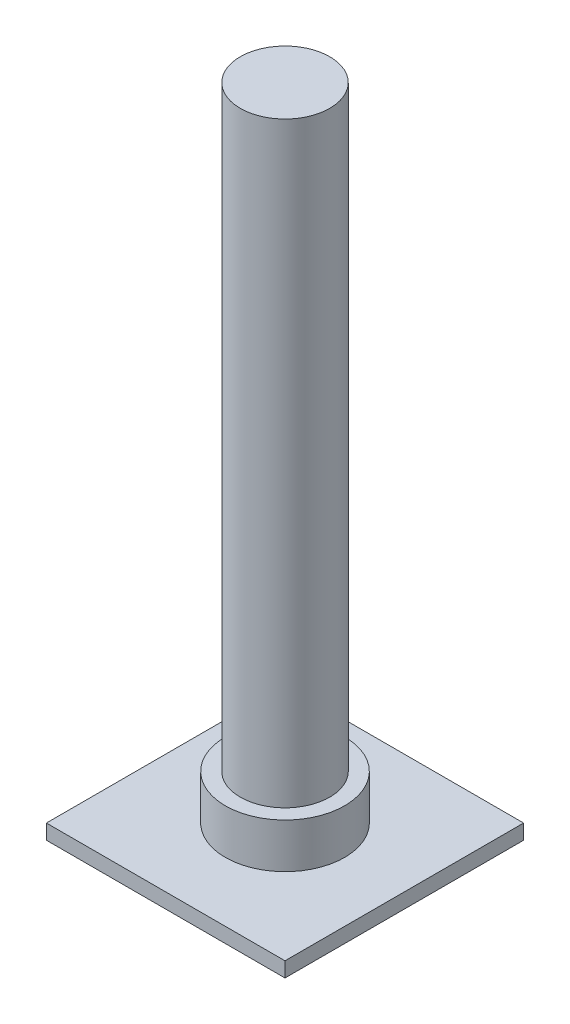
ISO-10303-21;
HEADER;
FILE_DESCRIPTION(('STEP AP214'),'2;1');
FILE_NAME('part.step','',(''),(''),'','','');
FILE_SCHEMA(('AUTOMOTIVE_DESIGN { 1 0 10303 214 1 1 1 1 }'));
ENDSEC;
DATA;
#1=APPLICATION_CONTEXT('core data for automotive mechanical design processes');
#2=APPLICATION_PROTOCOL_DEFINITION('international standard','automotive_design',2000,#1);
#3=PRODUCT_CONTEXT('',#1,'mechanical');
#4=PRODUCT('Part','Part','',(#3));
#5=PRODUCT_RELATED_PRODUCT_CATEGORY('part','',(#4));
#6=PRODUCT_DEFINITION_FORMATION('','',#4);
#7=PRODUCT_DEFINITION_CONTEXT('part definition',#1,'design');
#8=PRODUCT_DEFINITION('design','',#6,#7);
#9=PRODUCT_DEFINITION_SHAPE('','',#8);
#10=(LENGTH_UNIT() NAMED_UNIT(*) SI_UNIT(.MILLI.,.METRE.));
#11=(NAMED_UNIT(*) PLANE_ANGLE_UNIT() SI_UNIT($,.RADIAN.));
#12=(NAMED_UNIT(*) SI_UNIT($,.STERADIAN.) SOLID_ANGLE_UNIT());
#13=UNCERTAINTY_MEASURE_WITH_UNIT(LENGTH_MEASURE(1.E-05),#10,'distance_accuracy_value','');
#14=(GEOMETRIC_REPRESENTATION_CONTEXT(3) GLOBAL_UNCERTAINTY_ASSIGNED_CONTEXT((#13)) GLOBAL_UNIT_ASSIGNED_CONTEXT((#10,
#11,#12)) REPRESENTATION_CONTEXT('',''));
#15=CARTESIAN_POINT('',(0.,0.,0.));
#16=DIRECTION('',(0.,0.,1.));
#17=DIRECTION('',(1.,0.,0.));
#18=AXIS2_PLACEMENT_3D('',#15,#16,#17);
#19=CARTESIAN_POINT('',(0.,5.,0.));
#20=DIRECTION('',(1.,0.,0.));
#21=DIRECTION('',(0.,0.,-1.));
#22=AXIS2_PLACEMENT_3D('',#19,#20,#21);
#23=PLANE('',#22);
#24=DIRECTION('',(0.,0.,1.));
#25=VECTOR('',#24,1.);
#26=CARTESIAN_POINT('',(0.,0.,0.));
#27=LINE('',#26,#25);
#28=CARTESIAN_POINT('',(0.,0.,-80.));
#29=VERTEX_POINT('',#28);
#30=CARTESIAN_POINT('',(0.,0.,0.));
#31=VERTEX_POINT('',#30);
#32=EDGE_CURVE('E101',#29,#31,#27,.T.);
#33=ORIENTED_EDGE('',*,*,#32,.T.);
#34=DIRECTION('',(0.,-1.,0.));
#35=VECTOR('',#34,1.);
#36=CARTESIAN_POINT('',(0.,5.,0.));
#37=LINE('',#36,#35);
#38=CARTESIAN_POINT('',(0.,5.,0.));
#39=VERTEX_POINT('',#38);
#40=EDGE_CURVE('E37',#39,#31,#37,.T.);
#41=ORIENTED_EDGE('',*,*,#40,.F.);
#42=DIRECTION('',(0.,0.,1.));
#43=VECTOR('',#42,1.);
#44=CARTESIAN_POINT('',(0.,5.,0.));
#45=LINE('',#44,#43);
#46=CARTESIAN_POINT('',(0.,5.,-80.));
#47=VERTEX_POINT('',#46);
#48=EDGE_CURVE('E88',#47,#39,#45,.T.);
#49=ORIENTED_EDGE('',*,*,#48,.F.);
#50=DIRECTION('',(0.,-1.,0.));
#51=VECTOR('',#50,1.);
#52=CARTESIAN_POINT('',(0.,5.,-80.));
#53=LINE('',#52,#51);
#54=EDGE_CURVE('E97',#47,#29,#53,.T.);
#55=ORIENTED_EDGE('',*,*,#54,.T.);
#56=EDGE_LOOP('',(#33,#41,#49,#55));
#57=FACE_BOUND('',#56,.T.);
#58=ADVANCED_FACE('F34',(#57),#23,.F.);
#59=CARTESIAN_POINT('',(0.,5.,0.));
#60=DIRECTION('',(0.,0.,-1.));
#61=DIRECTION('',(-1.,0.,0.));
#62=AXIS2_PLACEMENT_3D('',#59,#60,#61);
#63=PLANE('',#62);
#64=DIRECTION('',(1.,0.,0.));
#65=VECTOR('',#64,1.);
#66=CARTESIAN_POINT('',(0.,0.,0.));
#67=LINE('',#66,#65);
#68=CARTESIAN_POINT('',(80.,0.,0.));
#69=VERTEX_POINT('',#68);
#70=EDGE_CURVE('E93',#31,#69,#67,.T.);
#71=ORIENTED_EDGE('',*,*,#70,.T.);
#72=DIRECTION('',(0.,-1.,0.));
#73=VECTOR('',#72,1.);
#74=CARTESIAN_POINT('',(80.,5.,0.));
#75=LINE('',#74,#73);
#76=CARTESIAN_POINT('',(80.,5.,0.));
#77=VERTEX_POINT('',#76);
#78=EDGE_CURVE('E91',#77,#69,#75,.T.);
#79=ORIENTED_EDGE('',*,*,#78,.F.);
#80=DIRECTION('',(1.,0.,0.));
#81=VECTOR('',#80,1.);
#82=CARTESIAN_POINT('',(0.,5.,0.));
#83=LINE('',#82,#81);
#84=EDGE_CURVE('E83',#39,#77,#83,.T.);
#85=ORIENTED_EDGE('',*,*,#84,.F.);
#86=ORIENTED_EDGE('',*,*,#40,.T.);
#87=EDGE_LOOP('',(#71,#79,#85,#86));
#88=FACE_BOUND('',#87,.T.);
#89=ADVANCED_FACE('F92',(#88),#63,.F.);
#90=CARTESIAN_POINT('',(80.,5.,0.));
#91=DIRECTION('',(-1.,0.,0.));
#92=DIRECTION('',(0.,0.,1.));
#93=AXIS2_PLACEMENT_3D('',#90,#91,#92);
#94=PLANE('',#93);
#95=DIRECTION('',(0.,0.,-1.));
#96=VECTOR('',#95,1.);
#97=CARTESIAN_POINT('',(80.,0.,0.));
#98=LINE('',#97,#96);
#99=CARTESIAN_POINT('',(80.,0.,-80.));
#100=VERTEX_POINT('',#99);
#101=EDGE_CURVE('E69',#69,#100,#98,.T.);
#102=ORIENTED_EDGE('',*,*,#101,.T.);
#103=DIRECTION('',(0.,-1.,0.));
#104=VECTOR('',#103,1.);
#105=CARTESIAN_POINT('',(80.,5.,-80.));
#106=LINE('',#105,#104);
#107=CARTESIAN_POINT('',(80.,5.,-80.));
#108=VERTEX_POINT('',#107);
#109=EDGE_CURVE('E94',#108,#100,#106,.T.);
#110=ORIENTED_EDGE('',*,*,#109,.F.);
#111=DIRECTION('',(0.,0.,-1.));
#112=VECTOR('',#111,1.);
#113=CARTESIAN_POINT('',(80.,5.,0.));
#114=LINE('',#113,#112);
#115=EDGE_CURVE('E86',#77,#108,#114,.T.);
#116=ORIENTED_EDGE('',*,*,#115,.F.);
#117=ORIENTED_EDGE('',*,*,#78,.T.);
#118=EDGE_LOOP('',(#102,#110,#116,#117));
#119=FACE_BOUND('',#118,.T.);
#120=ADVANCED_FACE('F95',(#119),#94,.F.);
#121=CARTESIAN_POINT('',(0.,5.,-80.));
#122=DIRECTION('',(0.,0.,1.));
#123=DIRECTION('',(1.,0.,0.));
#124=AXIS2_PLACEMENT_3D('',#121,#122,#123);
#125=PLANE('',#124);
#126=DIRECTION('',(-1.,0.,0.));
#127=VECTOR('',#126,1.);
#128=CARTESIAN_POINT('',(0.,0.,-80.));
#129=LINE('',#128,#127);
#130=EDGE_CURVE('E75',#100,#29,#129,.T.);
#131=ORIENTED_EDGE('',*,*,#130,.T.);
#132=ORIENTED_EDGE('',*,*,#54,.F.);
#133=DIRECTION('',(-1.,0.,0.));
#134=VECTOR('',#133,1.);
#135=CARTESIAN_POINT('',(0.,5.,-80.));
#136=LINE('',#135,#134);
#137=EDGE_CURVE('E52',#108,#47,#136,.T.);
#138=ORIENTED_EDGE('',*,*,#137,.F.);
#139=ORIENTED_EDGE('',*,*,#109,.T.);
#140=EDGE_LOOP('',(#131,#132,#138,#139));
#141=FACE_BOUND('',#140,.T.);
#142=ADVANCED_FACE('F109',(#141),#125,.F.);
#143=CARTESIAN_POINT('',(0.,5.,0.));
#144=DIRECTION('',(0.,-1.,0.));
#145=DIRECTION('',(0.,0.,-1.));
#146=AXIS2_PLACEMENT_3D('',#143,#144,#145);
#147=PLANE('',#146);
#148=CARTESIAN_POINT('',(40.,5.,-40.));
#149=DIRECTION('',(0.,1.,0.));
#150=DIRECTION('',(0.,0.,1.));
#151=AXIS2_PLACEMENT_3D('',#148,#149,#150);
#152=CIRCLE('',#151,20.);
#153=CARTESIAN_POINT('',(40.,5.,-20.));
#154=VERTEX_POINT('',#153);
#155=EDGE_CURVE('E43',#154,#154,#152,.T.);
#156=ORIENTED_EDGE('',*,*,#155,.F.);
#157=EDGE_LOOP('',(#156));
#158=FACE_BOUND('',#157,.T.);
#159=ORIENTED_EDGE('',*,*,#48,.T.);
#160=ORIENTED_EDGE('',*,*,#84,.T.);
#161=ORIENTED_EDGE('',*,*,#115,.T.);
#162=ORIENTED_EDGE('',*,*,#137,.T.);
#163=EDGE_LOOP('',(#159,#160,#161,#162));
#164=FACE_BOUND('',#163,.T.);
#165=ADVANCED_FACE('F84',(#158,#164),#147,.F.);
#166=CARTESIAN_POINT('',(0.,0.,0.));
#167=DIRECTION('',(0.,-1.,0.));
#168=DIRECTION('',(0.,0.,-1.));
#169=AXIS2_PLACEMENT_3D('',#166,#167,#168);
#170=PLANE('',#169);
#171=ORIENTED_EDGE('',*,*,#32,.F.);
#172=ORIENTED_EDGE('',*,*,#130,.F.);
#173=ORIENTED_EDGE('',*,*,#101,.F.);
#174=ORIENTED_EDGE('',*,*,#70,.F.);
#175=EDGE_LOOP('',(#171,#172,#173,#174));
#176=FACE_BOUND('',#175,.T.);
#177=ADVANCED_FACE('F112',(#176),#170,.T.);
#178=CARTESIAN_POINT('',(40.,20.,-40.));
#179=DIRECTION('',(0.,-1.,0.));
#180=DIRECTION('',(0.,0.,-1.));
#181=AXIS2_PLACEMENT_3D('',#178,#179,#180);
#182=CYLINDRICAL_SURFACE('',#181,20.);
#183=CARTESIAN_POINT('',(40.,20.,-40.));
#184=DIRECTION('',(0.,1.,0.));
#185=DIRECTION('',(0.,0.,1.));
#186=AXIS2_PLACEMENT_3D('',#183,#184,#185);
#187=CIRCLE('',#186,20.);
#188=CARTESIAN_POINT('',(40.,20.,-20.));
#189=VERTEX_POINT('',#188);
#190=EDGE_CURVE('E104',#189,#189,#187,.T.);
#191=ORIENTED_EDGE('',*,*,#190,.F.);
#192=EDGE_LOOP('',(#191));
#193=FACE_BOUND('',#192,.T.);
#194=ORIENTED_EDGE('',*,*,#155,.T.);
#195=EDGE_LOOP('',(#194));
#196=FACE_BOUND('',#195,.T.);
#197=ADVANCED_FACE('F134',(#193,#196),#182,.T.);
#198=CARTESIAN_POINT('',(40.,20.,-40.));
#199=DIRECTION('',(0.,1.,0.));
#200=DIRECTION('',(0.,0.,1.));
#201=AXIS2_PLACEMENT_3D('',#198,#199,#200);
#202=PLANE('',#201);
#203=CARTESIAN_POINT('',(40.,20.,-40.));
#204=DIRECTION('',(0.,1.,0.));
#205=DIRECTION('',(0.,0.,1.));
#206=AXIS2_PLACEMENT_3D('',#203,#204,#205);
#207=CIRCLE('',#206,15.);
#208=CARTESIAN_POINT('',(40.,20.,-25.));
#209=VERTEX_POINT('',#208);
#210=EDGE_CURVE('E11',#209,#209,#207,.T.);
#211=ORIENTED_EDGE('',*,*,#210,.F.);
#212=EDGE_LOOP('',(#211));
#213=FACE_BOUND('',#212,.T.);
#214=ORIENTED_EDGE('',*,*,#190,.T.);
#215=EDGE_LOOP('',(#214));
#216=FACE_BOUND('',#215,.T.);
#217=ADVANCED_FACE('F128',(#213,#216),#202,.T.);
#218=CARTESIAN_POINT('',(40.,220.,-40.));
#219=DIRECTION('',(0.,-1.,0.));
#220=DIRECTION('',(0.,0.,-1.));
#221=AXIS2_PLACEMENT_3D('',#218,#219,#220);
#222=CYLINDRICAL_SURFACE('',#221,15.);
#223=CARTESIAN_POINT('',(40.,220.,-40.));
#224=DIRECTION('',(0.,1.,0.));
#225=DIRECTION('',(0.,0.,1.));
#226=AXIS2_PLACEMENT_3D('',#223,#224,#225);
#227=CIRCLE('',#226,15.);
#228=CARTESIAN_POINT('',(40.,220.,-25.));
#229=VERTEX_POINT('',#228);
#230=EDGE_CURVE('E118',#229,#229,#227,.T.);
#231=ORIENTED_EDGE('',*,*,#230,.F.);
#232=EDGE_LOOP('',(#231));
#233=FACE_BOUND('',#232,.T.);
#234=ORIENTED_EDGE('',*,*,#210,.T.);
#235=EDGE_LOOP('',(#234));
#236=FACE_BOUND('',#235,.T.);
#237=ADVANCED_FACE('F125',(#233,#236),#222,.T.);
#238=CARTESIAN_POINT('',(40.,220.,-40.));
#239=DIRECTION('',(0.,1.,0.));
#240=DIRECTION('',(0.,0.,1.));
#241=AXIS2_PLACEMENT_3D('',#238,#239,#240);
#242=PLANE('',#241);
#243=ORIENTED_EDGE('',*,*,#230,.T.);
#244=EDGE_LOOP('',(#243));
#245=FACE_BOUND('',#244,.T.);
#246=ADVANCED_FACE('F123',(#245),#242,.T.);
#247=CLOSED_SHELL('',(#58,#89,#120,#142,#165,#177,#197,#217,#237,#246));
#248=MANIFOLD_SOLID_BREP('B2',#247);
#249=ADVANCED_BREP_SHAPE_REPRESENTATION('',(#18,#248),#14);
#250=SHAPE_DEFINITION_REPRESENTATION(#9,#249);
ENDSEC;
END-ISO-10303-21;
